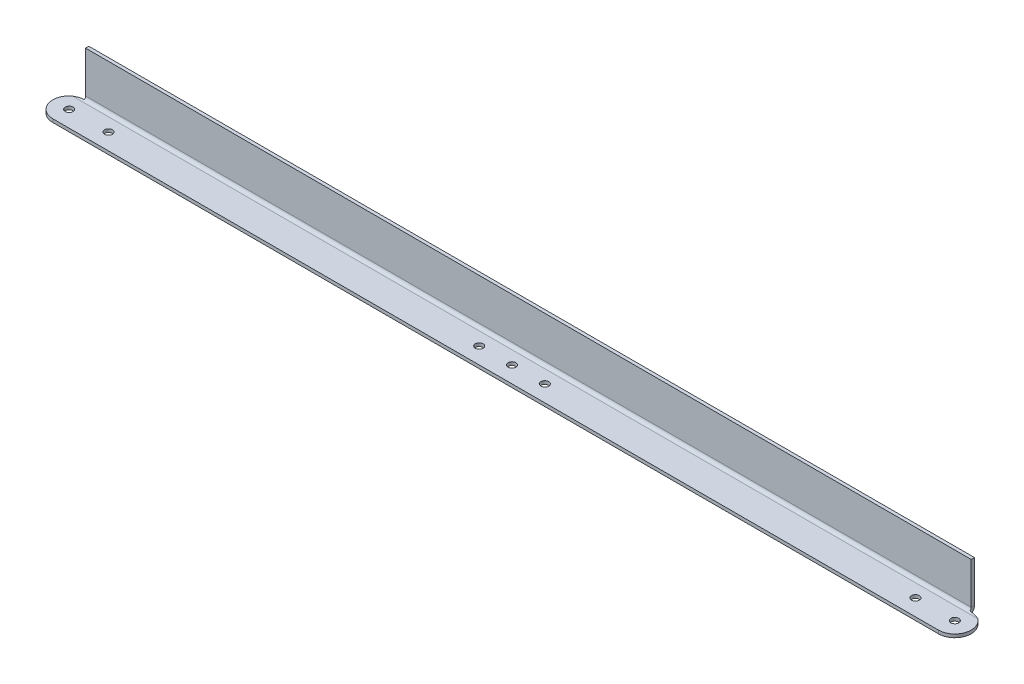
ISO-10303-21;
HEADER;
FILE_DESCRIPTION(('STEP AP214'),'2;1');
FILE_NAME('part.step','',(''),(''),'','','');
FILE_SCHEMA(('AUTOMOTIVE_DESIGN { 1 0 10303 214 1 1 1 1 }'));
ENDSEC;
DATA;
#1=APPLICATION_CONTEXT('core data for automotive mechanical design processes');
#2=APPLICATION_PROTOCOL_DEFINITION('international standard','automotive_design',2000,#1);
#3=PRODUCT_CONTEXT('',#1,'mechanical');
#4=PRODUCT('Part','Part','',(#3));
#5=PRODUCT_RELATED_PRODUCT_CATEGORY('part','',(#4));
#6=PRODUCT_DEFINITION_FORMATION('','',#4);
#7=PRODUCT_DEFINITION_CONTEXT('part definition',#1,'design');
#8=PRODUCT_DEFINITION('design','',#6,#7);
#9=PRODUCT_DEFINITION_SHAPE('','',#8);
#10=(LENGTH_UNIT() NAMED_UNIT(*) SI_UNIT(.MILLI.,.METRE.));
#11=(NAMED_UNIT(*) PLANE_ANGLE_UNIT() SI_UNIT($,.RADIAN.));
#12=(NAMED_UNIT(*) SI_UNIT($,.STERADIAN.) SOLID_ANGLE_UNIT());
#13=UNCERTAINTY_MEASURE_WITH_UNIT(LENGTH_MEASURE(1.E-05),#10,'distance_accuracy_value','');
#14=(GEOMETRIC_REPRESENTATION_CONTEXT(3) GLOBAL_UNCERTAINTY_ASSIGNED_CONTEXT((#13)) GLOBAL_UNIT_ASSIGNED_CONTEXT((#10,
#11,#12)) REPRESENTATION_CONTEXT('',''));
#15=CARTESIAN_POINT('',(0.,0.,0.));
#16=DIRECTION('',(0.,0.,1.));
#17=DIRECTION('',(1.,0.,0.));
#18=AXIS2_PLACEMENT_3D('',#15,#16,#17);
#19=CARTESIAN_POINT('',(-675.,-13.219513774519,24.9995137745192));
#20=DIRECTION('',(0.,1.,0.));
#21=DIRECTION('',(1.,0.,0.));
#22=AXIS2_PLACEMENT_3D('',#19,#20,#21);
#23=CYLINDRICAL_SURFACE('',#22,25.);
#24=CARTESIAN_POINT('',(-675.,-8.21951377451902,24.9995137745192));
#25=DIRECTION('',(0.,1.,0.));
#26=DIRECTION('',(-1.,0.,0.));
#27=AXIS2_PLACEMENT_3D('',#24,#25,#26);
#28=CIRCLE('',#27,25.);
#29=CARTESIAN_POINT('',(-690.000648278752,-8.21951377451909,5.00000000000003));
#30=VERTEX_POINT('',#29);
#31=CARTESIAN_POINT('',(-675.,-8.21951377451894,49.9995137745192));
#32=VERTEX_POINT('',#31);
#33=EDGE_CURVE('E83',#30,#32,#28,.T.);
#34=ORIENTED_EDGE('',*,*,#33,.F.);
#35=CARTESIAN_POINT('',(-690.00064827875,-13.2195137745191,5.00000000000005));
#36=CARTESIAN_POINT('',(-690.00064827875,-8.21951377451909,5.00000000000002));
#37=B_SPLINE_CURVE_WITH_KNOTS('',1,(#35,#36),.UNSPECIFIED.,.F.,.F.,(2,2),(0.,1.),.UNSPECIFIED.);
#38=CARTESIAN_POINT('',(-690.000648278751,-13.2195137745191,5.00000000000004));
#39=VERTEX_POINT('',#38);
#40=EDGE_CURVE('E275',#30,#39,#37,.F.);
#41=ORIENTED_EDGE('',*,*,#40,.T.);
#42=CARTESIAN_POINT('',(-675.,-13.219513774519,24.9995137745192));
#43=DIRECTION('',(0.,1.,0.));
#44=DIRECTION('',(-1.,0.,0.));
#45=AXIS2_PLACEMENT_3D('',#42,#43,#44);
#46=CIRCLE('',#45,25.);
#47=CARTESIAN_POINT('',(-675.,-13.2195137745189,49.9995137745192));
#48=VERTEX_POINT('',#47);
#49=EDGE_CURVE('E386',#39,#48,#46,.T.);
#50=ORIENTED_EDGE('',*,*,#49,.T.);
#51=DIRECTION('',(0.,1.,0.));
#52=VECTOR('',#51,1.);
#53=CARTESIAN_POINT('',(-675.,-13.2195137745189,49.9995137745192));
#54=LINE('',#53,#52);
#55=EDGE_CURVE('E385',#48,#32,#54,.T.);
#56=ORIENTED_EDGE('',*,*,#55,.T.);
#57=EDGE_LOOP('',(#34,#41,#50,#56));
#58=FACE_BOUND('',#57,.T.);
#59=ADVANCED_FACE('F57',(#58),#23,.T.);
#60=CARTESIAN_POINT('',(675.,-13.219513774519,24.9995137745192));
#61=DIRECTION('',(0.,1.,0.));
#62=DIRECTION('',(1.,0.,0.));
#63=AXIS2_PLACEMENT_3D('',#60,#61,#62);
#64=CYLINDRICAL_SURFACE('',#63,25.);
#65=CARTESIAN_POINT('',(675.,-13.219513774519,24.9995137745192));
#66=DIRECTION('',(0.,1.,0.));
#67=DIRECTION('',(1.,0.,0.));
#68=AXIS2_PLACEMENT_3D('',#65,#66,#67);
#69=CIRCLE('',#68,25.);
#70=CARTESIAN_POINT('',(675.,-13.2195137745189,49.9995137745192));
#71=VERTEX_POINT('',#70);
#72=CARTESIAN_POINT('',(690.000648278752,-13.2195137745191,5.00000000000003));
#73=VERTEX_POINT('',#72);
#74=EDGE_CURVE('E389',#71,#73,#69,.T.);
#75=ORIENTED_EDGE('',*,*,#74,.T.);
#76=CARTESIAN_POINT('',(690.000648278752,-8.21951377451909,5.00000000000001));
#77=CARTESIAN_POINT('',(690.000648278752,-13.2195137745191,5.00000000000002));
#78=B_SPLINE_CURVE_WITH_KNOTS('',1,(#76,#77),.UNSPECIFIED.,.F.,.F.,(2,2),(0.,1.),.UNSPECIFIED.);
#79=CARTESIAN_POINT('',(690.000648278752,-8.21951377451909,5.00000000000001));
#80=VERTEX_POINT('',#79);
#81=EDGE_CURVE('E12',#73,#80,#78,.F.);
#82=ORIENTED_EDGE('',*,*,#81,.T.);
#83=CARTESIAN_POINT('',(675.,-8.21951377451902,24.9995137745192));
#84=DIRECTION('',(0.,1.,0.));
#85=DIRECTION('',(1.,0.,0.));
#86=AXIS2_PLACEMENT_3D('',#83,#84,#85);
#87=CIRCLE('',#86,25.);
#88=CARTESIAN_POINT('',(675.,-8.21951377451894,49.9995137745192));
#89=VERTEX_POINT('',#88);
#90=EDGE_CURVE('E76',#89,#80,#87,.T.);
#91=ORIENTED_EDGE('',*,*,#90,.F.);
#92=DIRECTION('',(0.,1.,0.));
#93=VECTOR('',#92,1.);
#94=CARTESIAN_POINT('',(675.,-13.2195137745189,49.9995137745192));
#95=LINE('',#94,#93);
#96=EDGE_CURVE('E390',#71,#89,#95,.T.);
#97=ORIENTED_EDGE('',*,*,#96,.F.);
#98=EDGE_LOOP('',(#75,#82,#91,#97));
#99=FACE_BOUND('',#98,.T.);
#100=ADVANCED_FACE('F59',(#99),#64,.T.);
#101=CARTESIAN_POINT('',(675.,-8.21951377451902,24.9995137745192));
#102=DIRECTION('',(0.,1.,0.));
#103=DIRECTION('',(1.,0.,0.));
#104=AXIS2_PLACEMENT_3D('',#101,#102,#103);
#105=PLANE('',#104);
#106=CARTESIAN_POINT('',(50.,-8.21951377451902,24.9995137745192));
#107=DIRECTION('',(0.,1.,0.));
#108=DIRECTION('',(1.,0.,0.));
#109=AXIS2_PLACEMENT_3D('',#106,#107,#108);
#110=CIRCLE('',#109,6.);
#111=CARTESIAN_POINT('',(56.,-8.21951377451902,24.9995137745192));
#112=VERTEX_POINT('',#111);
#113=EDGE_CURVE('E343',#112,#112,#110,.T.);
#114=ORIENTED_EDGE('',*,*,#113,.F.);
#115=EDGE_LOOP('',(#114));
#116=FACE_BOUND('',#115,.T.);
#117=CARTESIAN_POINT('',(-50.,-8.21951377451902,24.9995137745192));
#118=DIRECTION('',(0.,1.,0.));
#119=DIRECTION('',(1.,0.,0.));
#120=AXIS2_PLACEMENT_3D('',#117,#118,#119);
#121=CIRCLE('',#120,6.);
#122=CARTESIAN_POINT('',(-44.,-8.21951377451902,24.9995137745192));
#123=VERTEX_POINT('',#122);
#124=EDGE_CURVE('E342',#123,#123,#121,.T.);
#125=ORIENTED_EDGE('',*,*,#124,.F.);
#126=EDGE_LOOP('',(#125));
#127=FACE_BOUND('',#126,.T.);
#128=CARTESIAN_POINT('',(0.,-8.21951377451902,24.9995137745192));
#129=DIRECTION('',(0.,1.,0.));
#130=DIRECTION('',(1.,0.,0.));
#131=AXIS2_PLACEMENT_3D('',#128,#129,#130);
#132=CIRCLE('',#131,6.);
#133=CARTESIAN_POINT('',(6.,-8.21951377451902,24.9995137745192));
#134=VERTEX_POINT('',#133);
#135=EDGE_CURVE('E350',#134,#134,#132,.T.);
#136=ORIENTED_EDGE('',*,*,#135,.F.);
#137=EDGE_LOOP('',(#136));
#138=FACE_BOUND('',#137,.T.);
#139=CARTESIAN_POINT('',(675.,-8.21951377451902,24.9995137745192));
#140=DIRECTION('',(0.,1.,0.));
#141=DIRECTION('',(-1.,0.,0.));
#142=AXIS2_PLACEMENT_3D('',#139,#140,#141);
#143=CIRCLE('',#142,6.00000000000001);
#144=CARTESIAN_POINT('',(669.,-8.21951377451902,24.9995137745192));
#145=VERTEX_POINT('',#144);
#146=EDGE_CURVE('E356',#145,#145,#143,.T.);
#147=ORIENTED_EDGE('',*,*,#146,.F.);
#148=EDGE_LOOP('',(#147));
#149=FACE_BOUND('',#148,.T.);
#150=CARTESIAN_POINT('',(615.,-8.21951377451902,24.9995137745191));
#151=DIRECTION('',(0.,1.,0.));
#152=DIRECTION('',(-1.,0.,0.));
#153=AXIS2_PLACEMENT_3D('',#150,#151,#152);
#154=CIRCLE('',#153,5.99999999999999);
#155=CARTESIAN_POINT('',(609.,-8.21951377451902,24.9995137745191));
#156=VERTEX_POINT('',#155);
#157=EDGE_CURVE('E362',#156,#156,#154,.T.);
#158=ORIENTED_EDGE('',*,*,#157,.F.);
#159=EDGE_LOOP('',(#158));
#160=FACE_BOUND('',#159,.T.);
#161=CARTESIAN_POINT('',(-615.,-8.21951377451902,24.9995137745192));
#162=DIRECTION('',(0.,1.,0.));
#163=DIRECTION('',(1.,0.,0.));
#164=AXIS2_PLACEMENT_3D('',#161,#162,#163);
#165=CIRCLE('',#164,5.99999999999999);
#166=CARTESIAN_POINT('',(-609.,-8.21951377451902,24.9995137745192));
#167=VERTEX_POINT('',#166);
#168=EDGE_CURVE('E368',#167,#167,#165,.T.);
#169=ORIENTED_EDGE('',*,*,#168,.F.);
#170=EDGE_LOOP('',(#169));
#171=FACE_BOUND('',#170,.T.);
#172=CARTESIAN_POINT('',(-675.,-8.21951377451902,24.9995137745192));
#173=DIRECTION('',(0.,1.,0.));
#174=DIRECTION('',(1.,0.,0.));
#175=AXIS2_PLACEMENT_3D('',#172,#173,#174);
#176=CIRCLE('',#175,5.99999999999999);
#177=CARTESIAN_POINT('',(-669.,-8.21951377451902,24.9995137745192));
#178=VERTEX_POINT('',#177);
#179=EDGE_CURVE('E374',#178,#178,#176,.T.);
#180=ORIENTED_EDGE('',*,*,#179,.F.);
#181=EDGE_LOOP('',(#180));
#182=FACE_BOUND('',#181,.T.);
#183=ORIENTED_EDGE('',*,*,#90,.T.);
#184=DIRECTION('',(-1.,0.,0.));
#185=VECTOR('',#184,1.);
#186=CARTESIAN_POINT('',(675.,-8.21951377451909,5.00000000000005));
#187=LINE('',#186,#185);
#188=EDGE_CURVE('E69',#80,#30,#187,.T.);
#189=ORIENTED_EDGE('',*,*,#188,.T.);
#190=ORIENTED_EDGE('',*,*,#33,.T.);
#191=DIRECTION('',(1.,0.,0.));
#192=VECTOR('',#191,1.);
#193=CARTESIAN_POINT('',(-675.,-8.21951377451894,49.9995137745192));
#194=LINE('',#193,#192);
#195=EDGE_CURVE('E387',#32,#89,#194,.T.);
#196=ORIENTED_EDGE('',*,*,#195,.T.);
#197=EDGE_LOOP('',(#183,#189,#190,#196));
#198=FACE_BOUND('',#197,.T.);
#199=ADVANCED_FACE('F421',(#116,#127,#138,#149,#160,#171,#182,#198),#105,.T.);
#200=CARTESIAN_POINT('',(-675.,-13.2195137745189,49.9995137745192));
#201=DIRECTION('',(0.,0.,1.));
#202=DIRECTION('',(0.,-1.,0.));
#203=AXIS2_PLACEMENT_3D('',#200,#201,#202);
#204=PLANE('',#203);
#205=ORIENTED_EDGE('',*,*,#195,.F.);
#206=ORIENTED_EDGE('',*,*,#55,.F.);
#207=DIRECTION('',(1.,0.,0.));
#208=VECTOR('',#207,1.);
#209=CARTESIAN_POINT('',(-675.,-13.2195137745189,49.9995137745192));
#210=LINE('',#209,#208);
#211=EDGE_CURVE('E382',#48,#71,#210,.T.);
#212=ORIENTED_EDGE('',*,*,#211,.T.);
#213=ORIENTED_EDGE('',*,*,#96,.T.);
#214=EDGE_LOOP('',(#205,#206,#212,#213));
#215=FACE_BOUND('',#214,.T.);
#216=ADVANCED_FACE('F426',(#215),#204,.T.);
#217=CARTESIAN_POINT('',(675.,-13.219513774519,24.9995137745192));
#218=DIRECTION('',(0.,1.,0.));
#219=DIRECTION('',(1.,0.,0.));
#220=AXIS2_PLACEMENT_3D('',#217,#218,#219);
#221=PLANE('',#220);
#222=DIRECTION('',(-1.,0.,0.));
#223=VECTOR('',#222,1.);
#224=CARTESIAN_POINT('',(675.,-13.2195137745191,5.00000000000003));
#225=LINE('',#224,#223);
#226=EDGE_CURVE('E292',#73,#39,#225,.T.);
#227=ORIENTED_EDGE('',*,*,#226,.F.);
#228=ORIENTED_EDGE('',*,*,#74,.F.);
#229=ORIENTED_EDGE('',*,*,#211,.F.);
#230=ORIENTED_EDGE('',*,*,#49,.F.);
#231=EDGE_LOOP('',(#227,#228,#229,#230));
#232=FACE_BOUND('',#231,.T.);
#233=CARTESIAN_POINT('',(50.,-13.219513774519,24.9995137745192));
#234=DIRECTION('',(0.,1.,0.));
#235=DIRECTION('',(1.,0.,0.));
#236=AXIS2_PLACEMENT_3D('',#233,#234,#235);
#237=CIRCLE('',#236,6.);
#238=CARTESIAN_POINT('',(56.,-13.219513774519,24.9995137745192));
#239=VERTEX_POINT('',#238);
#240=EDGE_CURVE('E339',#239,#239,#237,.T.);
#241=ORIENTED_EDGE('',*,*,#240,.T.);
#242=EDGE_LOOP('',(#241));
#243=FACE_BOUND('',#242,.T.);
#244=CARTESIAN_POINT('',(-50.,-13.219513774519,24.9995137745192));
#245=DIRECTION('',(0.,1.,0.));
#246=DIRECTION('',(1.,0.,0.));
#247=AXIS2_PLACEMENT_3D('',#244,#245,#246);
#248=CIRCLE('',#247,6.);
#249=CARTESIAN_POINT('',(-44.,-13.219513774519,24.9995137745192));
#250=VERTEX_POINT('',#249);
#251=EDGE_CURVE('E347',#250,#250,#248,.T.);
#252=ORIENTED_EDGE('',*,*,#251,.T.);
#253=EDGE_LOOP('',(#252));
#254=FACE_BOUND('',#253,.T.);
#255=CARTESIAN_POINT('',(0.,-13.219513774519,24.9995137745192));
#256=DIRECTION('',(0.,1.,0.));
#257=DIRECTION('',(1.,0.,0.));
#258=AXIS2_PLACEMENT_3D('',#255,#256,#257);
#259=CIRCLE('',#258,6.);
#260=CARTESIAN_POINT('',(6.,-13.219513774519,24.9995137745192));
#261=VERTEX_POINT('',#260);
#262=EDGE_CURVE('E353',#261,#261,#259,.T.);
#263=ORIENTED_EDGE('',*,*,#262,.T.);
#264=EDGE_LOOP('',(#263));
#265=FACE_BOUND('',#264,.T.);
#266=CARTESIAN_POINT('',(675.,-13.219513774519,24.9995137745192));
#267=DIRECTION('',(0.,1.,0.));
#268=DIRECTION('',(-1.,0.,0.));
#269=AXIS2_PLACEMENT_3D('',#266,#267,#268);
#270=CIRCLE('',#269,6.00000000000001);
#271=CARTESIAN_POINT('',(669.,-13.219513774519,24.9995137745192));
#272=VERTEX_POINT('',#271);
#273=EDGE_CURVE('E359',#272,#272,#270,.T.);
#274=ORIENTED_EDGE('',*,*,#273,.T.);
#275=EDGE_LOOP('',(#274));
#276=FACE_BOUND('',#275,.T.);
#277=CARTESIAN_POINT('',(615.,-13.219513774519,24.9995137745191));
#278=DIRECTION('',(0.,1.,0.));
#279=DIRECTION('',(-1.,0.,0.));
#280=AXIS2_PLACEMENT_3D('',#277,#278,#279);
#281=CIRCLE('',#280,5.99999999999999);
#282=CARTESIAN_POINT('',(609.,-13.219513774519,24.9995137745191));
#283=VERTEX_POINT('',#282);
#284=EDGE_CURVE('E365',#283,#283,#281,.T.);
#285=ORIENTED_EDGE('',*,*,#284,.T.);
#286=EDGE_LOOP('',(#285));
#287=FACE_BOUND('',#286,.T.);
#288=CARTESIAN_POINT('',(-615.,-13.219513774519,24.9995137745192));
#289=DIRECTION('',(0.,1.,0.));
#290=DIRECTION('',(1.,0.,0.));
#291=AXIS2_PLACEMENT_3D('',#288,#289,#290);
#292=CIRCLE('',#291,5.99999999999999);
#293=CARTESIAN_POINT('',(-609.,-13.219513774519,24.9995137745192));
#294=VERTEX_POINT('',#293);
#295=EDGE_CURVE('E371',#294,#294,#292,.T.);
#296=ORIENTED_EDGE('',*,*,#295,.T.);
#297=EDGE_LOOP('',(#296));
#298=FACE_BOUND('',#297,.T.);
#299=CARTESIAN_POINT('',(-675.,-13.219513774519,24.9995137745192));
#300=DIRECTION('',(0.,1.,0.));
#301=DIRECTION('',(1.,0.,0.));
#302=AXIS2_PLACEMENT_3D('',#299,#300,#301);
#303=CIRCLE('',#302,5.99999999999999);
#304=CARTESIAN_POINT('',(-669.,-13.219513774519,24.9995137745192));
#305=VERTEX_POINT('',#304);
#306=EDGE_CURVE('E377',#305,#305,#303,.T.);
#307=ORIENTED_EDGE('',*,*,#306,.T.);
#308=EDGE_LOOP('',(#307));
#309=FACE_BOUND('',#308,.T.);
#310=ADVANCED_FACE('F438',(#232,#243,#254,#265,#276,#287,#298,#309),#221,.F.);
#311=CARTESIAN_POINT('',(-675.,-13.219513774519,24.9995137745192));
#312=DIRECTION('',(0.,1.,0.));
#313=DIRECTION('',(1.,0.,0.));
#314=AXIS2_PLACEMENT_3D('',#311,#312,#313);
#315=CYLINDRICAL_SURFACE('',#314,5.99999999999999);
#316=ORIENTED_EDGE('',*,*,#306,.F.);
#317=EDGE_LOOP('',(#316));
#318=FACE_BOUND('',#317,.T.);
#319=ORIENTED_EDGE('',*,*,#179,.T.);
#320=EDGE_LOOP('',(#319));
#321=FACE_BOUND('',#320,.T.);
#322=ADVANCED_FACE('F441',(#318,#321),#315,.F.);
#323=CARTESIAN_POINT('',(-615.,-13.219513774519,24.9995137745192));
#324=DIRECTION('',(0.,1.,0.));
#325=DIRECTION('',(1.,0.,0.));
#326=AXIS2_PLACEMENT_3D('',#323,#324,#325);
#327=CYLINDRICAL_SURFACE('',#326,5.99999999999999);
#328=ORIENTED_EDGE('',*,*,#295,.F.);
#329=EDGE_LOOP('',(#328));
#330=FACE_BOUND('',#329,.T.);
#331=ORIENTED_EDGE('',*,*,#168,.T.);
#332=EDGE_LOOP('',(#331));
#333=FACE_BOUND('',#332,.T.);
#334=ADVANCED_FACE('F447',(#330,#333),#327,.F.);
#335=CARTESIAN_POINT('',(615.,-13.219513774519,24.9995137745191));
#336=DIRECTION('',(0.,1.,0.));
#337=DIRECTION('',(1.,0.,0.));
#338=AXIS2_PLACEMENT_3D('',#335,#336,#337);
#339=CYLINDRICAL_SURFACE('',#338,5.99999999999999);
#340=ORIENTED_EDGE('',*,*,#284,.F.);
#341=EDGE_LOOP('',(#340));
#342=FACE_BOUND('',#341,.T.);
#343=ORIENTED_EDGE('',*,*,#157,.T.);
#344=EDGE_LOOP('',(#343));
#345=FACE_BOUND('',#344,.T.);
#346=ADVANCED_FACE('F451',(#342,#345),#339,.F.);
#347=CARTESIAN_POINT('',(675.,-13.219513774519,24.9995137745192));
#348=DIRECTION('',(0.,1.,0.));
#349=DIRECTION('',(1.,0.,0.));
#350=AXIS2_PLACEMENT_3D('',#347,#348,#349);
#351=CYLINDRICAL_SURFACE('',#350,6.00000000000001);
#352=ORIENTED_EDGE('',*,*,#273,.F.);
#353=EDGE_LOOP('',(#352));
#354=FACE_BOUND('',#353,.T.);
#355=ORIENTED_EDGE('',*,*,#146,.T.);
#356=EDGE_LOOP('',(#355));
#357=FACE_BOUND('',#356,.T.);
#358=ADVANCED_FACE('F455',(#354,#357),#351,.F.);
#359=CARTESIAN_POINT('',(0.,-13.219513774519,24.9995137745192));
#360=DIRECTION('',(0.,1.,0.));
#361=DIRECTION('',(1.,0.,0.));
#362=AXIS2_PLACEMENT_3D('',#359,#360,#361);
#363=CYLINDRICAL_SURFACE('',#362,6.);
#364=ORIENTED_EDGE('',*,*,#262,.F.);
#365=EDGE_LOOP('',(#364));
#366=FACE_BOUND('',#365,.T.);
#367=ORIENTED_EDGE('',*,*,#135,.T.);
#368=EDGE_LOOP('',(#367));
#369=FACE_BOUND('',#368,.T.);
#370=ADVANCED_FACE('F459',(#366,#369),#363,.F.);
#371=CARTESIAN_POINT('',(-50.,-13.219513774519,24.9995137745192));
#372=DIRECTION('',(0.,1.,0.));
#373=DIRECTION('',(1.,0.,0.));
#374=AXIS2_PLACEMENT_3D('',#371,#372,#373);
#375=CYLINDRICAL_SURFACE('',#374,6.);
#376=ORIENTED_EDGE('',*,*,#251,.F.);
#377=EDGE_LOOP('',(#376));
#378=FACE_BOUND('',#377,.T.);
#379=ORIENTED_EDGE('',*,*,#124,.T.);
#380=EDGE_LOOP('',(#379));
#381=FACE_BOUND('',#380,.T.);
#382=ADVANCED_FACE('F463',(#378,#381),#375,.F.);
#383=CARTESIAN_POINT('',(50.,-13.219513774519,24.9995137745192));
#384=DIRECTION('',(0.,1.,0.));
#385=DIRECTION('',(1.,0.,0.));
#386=AXIS2_PLACEMENT_3D('',#383,#384,#385);
#387=CYLINDRICAL_SURFACE('',#386,6.);
#388=ORIENTED_EDGE('',*,*,#240,.F.);
#389=EDGE_LOOP('',(#388));
#390=FACE_BOUND('',#389,.T.);
#391=ORIENTED_EDGE('',*,*,#113,.T.);
#392=EDGE_LOOP('',(#391));
#393=FACE_BOUND('',#392,.T.);
#394=ADVANCED_FACE('F467',(#390,#393),#387,.F.);
#395=CARTESIAN_POINT('',(-675.,60.,-5.));
#396=DIRECTION('',(0.,1.,0.));
#397=DIRECTION('',(0.,0.,1.));
#398=AXIS2_PLACEMENT_3D('',#395,#396,#397);
#399=PLANE('',#398);
#400=DIRECTION('',(-1.,0.,0.));
#401=VECTOR('',#400,1.);
#402=CARTESIAN_POINT('',(-675.,60.,0.));
#403=LINE('',#402,#401);
#404=CARTESIAN_POINT('',(675.,60.,0.));
#405=VERTEX_POINT('',#404);
#406=CARTESIAN_POINT('',(-675.,60.,0.));
#407=VERTEX_POINT('',#406);
#408=EDGE_CURVE('E514',#405,#407,#403,.T.);
#409=ORIENTED_EDGE('',*,*,#408,.F.);
#410=DIRECTION('',(0.,0.,1.));
#411=VECTOR('',#410,1.);
#412=CARTESIAN_POINT('',(675.,60.,-5.));
#413=LINE('',#412,#411);
#414=CARTESIAN_POINT('',(675.,60.,-5.));
#415=VERTEX_POINT('',#414);
#416=EDGE_CURVE('E346',#415,#405,#413,.T.);
#417=ORIENTED_EDGE('',*,*,#416,.F.);
#418=DIRECTION('',(-1.,0.,0.));
#419=VECTOR('',#418,1.);
#420=CARTESIAN_POINT('',(-675.,60.,-5.));
#421=LINE('',#420,#419);
#422=CARTESIAN_POINT('',(-675.,60.,-5.));
#423=VERTEX_POINT('',#422);
#424=EDGE_CURVE('E329',#415,#423,#421,.T.);
#425=ORIENTED_EDGE('',*,*,#424,.T.);
#426=DIRECTION('',(0.,0.,1.));
#427=VECTOR('',#426,1.);
#428=CARTESIAN_POINT('',(-675.,60.,-5.));
#429=LINE('',#428,#427);
#430=EDGE_CURVE('E333',#423,#407,#429,.T.);
#431=ORIENTED_EDGE('',*,*,#430,.T.);
#432=EDGE_LOOP('',(#409,#417,#425,#431));
#433=FACE_BOUND('',#432,.T.);
#434=ADVANCED_FACE('F471',(#433),#399,.T.);
#435=CARTESIAN_POINT('',(675.,-35.,-5.));
#436=DIRECTION('',(0.,0.,1.));
#437=DIRECTION('',(1.,0.,0.));
#438=AXIS2_PLACEMENT_3D('',#435,#436,#437);
#439=PLANE('',#438);
#440=DIRECTION('',(0.,1.,0.));
#441=VECTOR('',#440,1.);
#442=CARTESIAN_POINT('',(675.,-9.99999999999995,-5.));
#443=LINE('',#442,#441);
#444=CARTESIAN_POINT('',(675.,-3.21951377451909,-5.));
#445=VERTEX_POINT('',#444);
#446=EDGE_CURVE('E510',#445,#415,#443,.T.);
#447=ORIENTED_EDGE('',*,*,#446,.F.);
#448=DIRECTION('',(-1.,0.,0.));
#449=VECTOR('',#448,1.);
#450=CARTESIAN_POINT('',(675.,-3.21951377451909,-5.));
#451=LINE('',#450,#449);
#452=CARTESIAN_POINT('',(-674.999999999999,-3.21951377451909,-5.));
#453=VERTEX_POINT('',#452);
#454=EDGE_CURVE('E172',#445,#453,#451,.T.);
#455=ORIENTED_EDGE('',*,*,#454,.T.);
#456=DIRECTION('',(0.,-1.,0.));
#457=VECTOR('',#456,1.);
#458=CARTESIAN_POINT('',(-675.,-10.,-5.));
#459=LINE('',#458,#457);
#460=EDGE_CURVE('E519',#423,#453,#459,.T.);
#461=ORIENTED_EDGE('',*,*,#460,.F.);
#462=ORIENTED_EDGE('',*,*,#424,.F.);
#463=EDGE_LOOP('',(#447,#455,#461,#462));
#464=FACE_BOUND('',#463,.T.);
#465=ADVANCED_FACE('F484',(#464),#439,.F.);
#466=CARTESIAN_POINT('',(-675.,-10.,-5.));
#467=DIRECTION('',(-1.,0.,0.));
#468=DIRECTION('',(0.,0.,1.));
#469=AXIS2_PLACEMENT_3D('',#466,#467,#468);
#470=PLANE('',#469);
#471=DIRECTION('',(0.,0.,-1.));
#472=VECTOR('',#471,1.);
#473=CARTESIAN_POINT('',(-675.,-3.21951377451909,-4.99999999999995));
#474=LINE('',#473,#472);
#475=CARTESIAN_POINT('',(-675.,-3.21951377451912,0.));
#476=VERTEX_POINT('',#475);
#477=EDGE_CURVE('E326',#476,#453,#474,.T.);
#478=ORIENTED_EDGE('',*,*,#477,.F.);
#479=DIRECTION('',(0.,-1.,0.));
#480=VECTOR('',#479,1.);
#481=CARTESIAN_POINT('',(-675.,-10.,0.));
#482=LINE('',#481,#480);
#483=EDGE_CURVE('E512',#407,#476,#482,.T.);
#484=ORIENTED_EDGE('',*,*,#483,.F.);
#485=ORIENTED_EDGE('',*,*,#430,.F.);
#486=ORIENTED_EDGE('',*,*,#460,.T.);
#487=EDGE_LOOP('',(#478,#484,#485,#486));
#488=FACE_BOUND('',#487,.T.);
#489=ADVANCED_FACE('F480',(#488),#470,.T.);
#490=CARTESIAN_POINT('',(675.,-35.,0.));
#491=DIRECTION('',(0.,0.,1.));
#492=DIRECTION('',(1.,0.,0.));
#493=AXIS2_PLACEMENT_3D('',#490,#491,#492);
#494=PLANE('',#493);
#495=DIRECTION('',(-1.,0.,0.));
#496=VECTOR('',#495,1.);
#497=CARTESIAN_POINT('',(675.,-3.21951377451912,0.));
#498=LINE('',#497,#496);
#499=CARTESIAN_POINT('',(675.,-3.21951377451912,0.));
#500=VERTEX_POINT('',#499);
#501=EDGE_CURVE('E330',#500,#476,#498,.T.);
#502=ORIENTED_EDGE('',*,*,#501,.F.);
#503=DIRECTION('',(0.,1.,0.));
#504=VECTOR('',#503,1.);
#505=CARTESIAN_POINT('',(675.,-9.99999999999995,0.));
#506=LINE('',#505,#504);
#507=EDGE_CURVE('E517',#500,#405,#506,.T.);
#508=ORIENTED_EDGE('',*,*,#507,.T.);
#509=ORIENTED_EDGE('',*,*,#408,.T.);
#510=ORIENTED_EDGE('',*,*,#483,.T.);
#511=EDGE_LOOP('',(#502,#508,#509,#510));
#512=FACE_BOUND('',#511,.T.);
#513=ADVANCED_FACE('F476',(#512),#494,.T.);
#514=CARTESIAN_POINT('',(675.,-9.99999999999995,-5.));
#515=DIRECTION('',(1.,0.,0.));
#516=DIRECTION('',(0.,0.,-1.));
#517=AXIS2_PLACEMENT_3D('',#514,#515,#516);
#518=PLANE('',#517);
#519=DIRECTION('',(0.,0.,1.));
#520=VECTOR('',#519,1.);
#521=CARTESIAN_POINT('',(675.,-3.21951377451909,-4.99999999999995));
#522=LINE('',#521,#520);
#523=EDGE_CURVE('E151',#445,#500,#522,.T.);
#524=ORIENTED_EDGE('',*,*,#523,.F.);
#525=ORIENTED_EDGE('',*,*,#446,.T.);
#526=ORIENTED_EDGE('',*,*,#416,.T.);
#527=ORIENTED_EDGE('',*,*,#507,.F.);
#528=EDGE_LOOP('',(#524,#525,#526,#527));
#529=FACE_BOUND('',#528,.T.);
#530=ADVANCED_FACE('F473',(#529),#518,.T.);
#531=CARTESIAN_POINT('',(675.,-11.0779854762339,-1.18420750891718));
#532=CARTESIAN_POINT('',(676.412671145493,-11.0821347914643,-1.17893484038641));
#533=CARTESIAN_POINT('',(677.798698093379,-11.1809330756484,-1.05873493540471));
#534=CARTESIAN_POINT('',(679.837770459299,-11.4459990312004,-0.687535221699956));
#535=CARTESIAN_POINT('',(680.510800003037,-11.5533352559704,-0.5316064150216));
#536=CARTESIAN_POINT('',(681.510352451292,-11.734676319145,-0.244503726993768));
#537=CARTESIAN_POINT('',(681.841871289485,-11.7984750753531,-0.139921057869663));
#538=CARTESIAN_POINT('',(682.336651579936,-11.8978225538454,0.0309660796838068));
#539=CARTESIAN_POINT('',(682.501162015614,-11.9315439741547,0.0902642573966918));
#540=CARTESIAN_POINT('',(682.829350231356,-11.9999358454026,0.213648203620914));
#541=CARTESIAN_POINT('',(682.996149419936,-12.0352755358077,0.279006160642819));
#542=CARTESIAN_POINT('',(683.796849638648,-12.2069429319396,0.605329437931457));
#543=CARTESIAN_POINT('',(684.420416854446,-12.3462905025764,0.898018558836963));
#544=CARTESIAN_POINT('',(685.330278239385,-12.5459596932819,1.38773162386081));
#545=CARTESIAN_POINT('',(685.629317127905,-12.6109275264842,1.55940302474482));
#546=CARTESIAN_POINT('',(686.071503100995,-12.7041808025712,1.82979790570624));
#547=CARTESIAN_POINT('',(686.21783636541,-12.734563614431,1.9220760564333));
#548=CARTESIAN_POINT('',(686.435743172111,-12.7788418844244,2.06372797551544));
#549=CARTESIAN_POINT('',(686.508113259357,-12.7933852026856,2.11148428529127));
#550=CARTESIAN_POINT('',(686.616270117746,-12.8148445696974,2.18392805127469));
#551=CARTESIAN_POINT('',(686.652256025129,-12.8219384166777,2.20821084909481));
#552=CARTESIAN_POINT('',(686.706135318084,-12.8324862803316,2.24483738767482));
#553=CARTESIAN_POINT('',(686.724078487715,-12.8359867499841,2.25707995700377));
#554=CARTESIAN_POINT('',(686.750968350132,-12.8412137240438,2.27549439460172));
#555=CARTESIAN_POINT('',(686.759927488933,-12.8429520936338,2.28164097103613));
#556=CARTESIAN_POINT('',(686.777837469191,-12.8464208384567,2.29395098446785));
#557=CARTESIAN_POINT('',(686.78971344356,-12.8487156414597,2.30213232141013));
#558=CARTESIAN_POINT('',(687.181114835382,-12.9242396677068,2.57214017093161));
#559=CARTESIAN_POINT('',(687.640880857633,-13.0128924068252,2.9272322503277));
#560=CARTESIAN_POINT('',(688.709185282739,-13.1605573111754,3.82429400694888));
#561=CARTESIAN_POINT('',(689.317517284551,-13.2195137745191,4.36673260144675));
#562=CARTESIAN_POINT('',(690.000648278752,-13.2195137745191,5.00000000000002));
#563=CARTESIAN_POINT('',(675.000000000001,-7.14874962537649,1.90789624554141));
#564=CARTESIAN_POINT('',(676.412671438742,-7.15082428342237,1.91053258035407));
#565=CARTESIAN_POINT('',(677.798698093379,-7.20022342508375,1.97063253229764));
#566=CARTESIAN_POINT('',(679.837770459299,-7.33275640285972,2.15623238915003));
#567=CARTESIAN_POINT('',(680.510800003037,-7.38642451524474,2.2341967924892));
#568=CARTESIAN_POINT('',(681.510352451292,-7.47709504683205,2.37774813650312));
#569=CARTESIAN_POINT('',(681.841871289485,-7.50899442493609,2.43003947106517));
#570=CARTESIAN_POINT('',(682.336651579936,-7.55866816418224,2.51548303984191));
#571=CARTESIAN_POINT('',(682.501162015614,-7.5755288743369,2.54513212869835));
#572=CARTESIAN_POINT('',(682.829350231356,-7.60972480996084,2.60682410181046));
#573=CARTESIAN_POINT('',(682.996149419936,-7.62739465516342,2.63950308032141));
#574=CARTESIAN_POINT('',(683.796849638648,-7.71322835322936,2.80266471896573));
#575=CARTESIAN_POINT('',(684.420416854446,-7.78290213854774,2.94900927941848));
#576=CARTESIAN_POINT('',(685.330278239385,-7.88273673390051,3.19386581193041));
#577=CARTESIAN_POINT('',(685.629317127905,-7.91522065050163,3.27970151237241));
#578=CARTESIAN_POINT('',(686.071503100995,-7.96184728854514,3.41489895285312));
#579=CARTESIAN_POINT('',(686.217836365411,-7.97703869447502,3.46103802821665));
#580=CARTESIAN_POINT('',(686.435743172111,-7.99917782947175,3.53186398775772));
#581=CARTESIAN_POINT('',(686.508113259357,-8.00644948860237,3.55574214264563));
#582=CARTESIAN_POINT('',(686.616270117746,-8.01717917210827,3.59196402563734));
#583=CARTESIAN_POINT('',(686.652256025129,-8.0207260955984,3.60410542454741));
#584=CARTESIAN_POINT('',(686.706135318084,-8.02600002742534,3.62241869383741));
#585=CARTESIAN_POINT('',(686.724078487715,-8.02775026225161,3.62853997850189));
#586=CARTESIAN_POINT('',(686.750968350132,-8.03036374928143,3.63774719730086));
#587=CARTESIAN_POINT('',(686.759927488933,-8.03123293407646,3.64082048551806));
#588=CARTESIAN_POINT('',(686.777837469191,-8.03296730648792,3.64697549223392));
#589=CARTESIAN_POINT('',(686.78971344356,-8.03411470798937,3.65106616070506));
#590=CARTESIAN_POINT('',(687.181114835382,-8.07187672111295,3.78607008546581));
#591=CARTESIAN_POINT('',(687.640880857633,-8.11620309067217,3.96361612516385));
#592=CARTESIAN_POINT('',(688.709185282739,-8.19003554284723,4.41214700347444));
#593=CARTESIAN_POINT('',(689.317644709842,-8.21951377451909,4.68342536280888));
#594=CARTESIAN_POINT('',(690.000648278752,-8.21951377451909,5.00000000000001));
#595=B_SPLINE_SURFACE_WITH_KNOTS('',1,3,((#531,#532,#533,#534,#535,#536,#537,#538,#539,#540,
#541,#542,#543,#544,#545,#546,#547,#548,#549,#550,#551,#552,#553,#554,#555,#556,#557,#558,#559,
#560,#561,#562),(#563,#564,#565,#566,#567,#568,#569,#570,#571,#572,#573,#574,#575,#576,#577,
#578,#579,#580,#581,#582,#583,#584,#585,#586,#587,#588,#589,#590,#591,#592,#593,#594)),
.UNSPECIFIED.,.F.,.F.,.F.,(2,2),(4,2,2,2,2,2,2,2,2,2,2,2,2,2,2,4),(0.,1.),(0.,0.25,0.375,0.4375,
0.46875,0.5,0.625,0.6875,0.71875,0.734375,0.7421875,0.74609375,0.748046875,0.75,0.875,1.),.UNSPECIFIED.);
#596=CARTESIAN_POINT('',(675.,-11.0779854762339,-1.18420750891718));
#597=CARTESIAN_POINT('',(675.000000000001,-7.14874962537649,1.90789624554141));
#598=B_SPLINE_CURVE_WITH_KNOTS('',1,(#596,#597),.UNSPECIFIED.,.F.,.F.,(2,2),(0.,1.),.UNSPECIFIED.);
#599=CARTESIAN_POINT('',(675.000000000001,-7.14874962537649,1.90789624554141));
#600=VERTEX_POINT('',#599);
#601=CARTESIAN_POINT('',(675.,-11.0779854762339,-1.18420750891718));
#602=VERTEX_POINT('',#601);
#603=EDGE_CURVE('E138',#600,#602,#598,.F.);
#604=CARTESIAN_POINT('',(675.000000000001,-7.14874962537649,1.90789624554141));
#605=CARTESIAN_POINT('',(676.412671438742,-7.15082428342237,1.91053258035407));
#606=CARTESIAN_POINT('',(677.798698093379,-7.20022342508375,1.97063253229764));
#607=CARTESIAN_POINT('',(679.837770459299,-7.33275640285972,2.15623238915003));
#608=CARTESIAN_POINT('',(680.510800003037,-7.38642451524474,2.2341967924892));
#609=CARTESIAN_POINT('',(681.510352451292,-7.47709504683205,2.37774813650312));
#610=CARTESIAN_POINT('',(681.841871289485,-7.50899442493609,2.43003947106517));
#611=CARTESIAN_POINT('',(682.336651579936,-7.55866816418224,2.51548303984191));
#612=CARTESIAN_POINT('',(682.501162015614,-7.5755288743369,2.54513212869835));
#613=CARTESIAN_POINT('',(682.829350231356,-7.60972480996084,2.60682410181046));
#614=CARTESIAN_POINT('',(682.996149419936,-7.62739465516342,2.63950308032141));
#615=CARTESIAN_POINT('',(683.796849638648,-7.71322835322936,2.80266471896573));
#616=CARTESIAN_POINT('',(684.420416854446,-7.78290213854774,2.94900927941848));
#617=CARTESIAN_POINT('',(685.330278239385,-7.88273673390051,3.19386581193041));
#618=CARTESIAN_POINT('',(685.629317127905,-7.91522065050163,3.27970151237241));
#619=CARTESIAN_POINT('',(686.071503100995,-7.96184728854514,3.41489895285312));
#620=CARTESIAN_POINT('',(686.217836365411,-7.97703869447502,3.46103802821665));
#621=CARTESIAN_POINT('',(686.435743172111,-7.99917782947175,3.53186398775772));
#622=CARTESIAN_POINT('',(686.508113259357,-8.00644948860237,3.55574214264563));
#623=CARTESIAN_POINT('',(686.616270117746,-8.01717917210827,3.59196402563734));
#624=CARTESIAN_POINT('',(686.652256025129,-8.0207260955984,3.60410542454741));
#625=CARTESIAN_POINT('',(686.706135318084,-8.02600002742534,3.62241869383741));
#626=CARTESIAN_POINT('',(686.724078487715,-8.02775026225161,3.62853997850189));
#627=CARTESIAN_POINT('',(686.750968350132,-8.03036374928143,3.63774719730086));
#628=CARTESIAN_POINT('',(686.759927488933,-8.03123293407646,3.64082048551806));
#629=CARTESIAN_POINT('',(686.777837469191,-8.03296730648792,3.64697549223392));
#630=CARTESIAN_POINT('',(686.78971344356,-8.03411470798937,3.65106616070506));
#631=CARTESIAN_POINT('',(687.181114835382,-8.07187672111295,3.78607008546581));
#632=CARTESIAN_POINT('',(687.640880857633,-8.11620309067217,3.96361612516385));
#633=CARTESIAN_POINT('',(688.709185282739,-8.19003554284723,4.41214700347444));
#634=CARTESIAN_POINT('',(689.317644709842,-8.21951377451909,4.68342536280888));
#635=CARTESIAN_POINT('',(690.000648278752,-8.21951377451909,5.00000000000001));
#636=B_SPLINE_CURVE_WITH_KNOTS('',3,(#604,#605,#606,#607,#608,#609,#610,#611,#612,#613,#614,
#615,#616,#617,#618,#619,#620,#621,#622,#623,#624,#625,#626,#627,#628,#629,#630,#631,#632,#633,
#634,#635),.UNSPECIFIED.,.F.,.F.,(4,2,2,2,2,2,2,2,2,2,2,2,2,2,2,4),(0.,0.25,0.375,0.4375,
0.46875,0.5,0.625,0.6875,0.71875,0.734375,0.7421875,0.74609375,0.748046875,0.75,0.875,1.),.UNSPECIFIED.);
#637=EDGE_CURVE('E183',#600,#80,#636,.T.);
#638=CARTESIAN_POINT('',(690.000648278752,-13.2195137745191,5.00000000000002));
#639=CARTESIAN_POINT('',(689.317517284551,-13.2195137745191,4.36673260144675));
#640=CARTESIAN_POINT('',(688.709185282739,-13.1605573111754,3.82429400694888));
#641=CARTESIAN_POINT('',(687.640880857633,-13.0128924068252,2.9272322503277));
#642=CARTESIAN_POINT('',(687.181114835382,-12.9242396677068,2.57214017093161));
#643=CARTESIAN_POINT('',(686.78971344356,-12.8487156414597,2.30213232141013));
#644=CARTESIAN_POINT('',(686.777837469191,-12.8464208384567,2.29395098446785));
#645=CARTESIAN_POINT('',(686.759927488933,-12.8429520936338,2.28164097103613));
#646=CARTESIAN_POINT('',(686.750968350132,-12.8412137240438,2.27549439460172));
#647=CARTESIAN_POINT('',(686.724078487715,-12.8359867499841,2.25707995700377));
#648=CARTESIAN_POINT('',(686.706135318084,-12.8324862803316,2.24483738767482));
#649=CARTESIAN_POINT('',(686.652256025129,-12.8219384166777,2.20821084909481));
#650=CARTESIAN_POINT('',(686.616270117746,-12.8148445696974,2.18392805127469));
#651=CARTESIAN_POINT('',(686.508113259357,-12.7933852026856,2.11148428529127));
#652=CARTESIAN_POINT('',(686.435743172111,-12.7788418844244,2.06372797551544));
#653=CARTESIAN_POINT('',(686.21783636541,-12.734563614431,1.9220760564333));
#654=CARTESIAN_POINT('',(686.071503100995,-12.7041808025712,1.82979790570624));
#655=CARTESIAN_POINT('',(685.629317127905,-12.6109275264842,1.55940302474482));
#656=CARTESIAN_POINT('',(685.330278239385,-12.5459596932819,1.38773162386081));
#657=CARTESIAN_POINT('',(684.420416854446,-12.3462905025764,0.898018558836963));
#658=CARTESIAN_POINT('',(683.796849638648,-12.2069429319396,0.605329437931457));
#659=CARTESIAN_POINT('',(682.996149419936,-12.0352755358077,0.279006160642819));
#660=CARTESIAN_POINT('',(682.829350231356,-11.9999358454026,0.213648203620914));
#661=CARTESIAN_POINT('',(682.501162015614,-11.9315439741547,0.0902642573966918));
#662=CARTESIAN_POINT('',(682.336651579936,-11.8978225538454,0.0309660796838068));
#663=CARTESIAN_POINT('',(681.841871289485,-11.7984750753531,-0.139921057869663));
#664=CARTESIAN_POINT('',(681.510352451292,-11.734676319145,-0.244503726993768));
#665=CARTESIAN_POINT('',(680.510800003037,-11.5533352559704,-0.5316064150216));
#666=CARTESIAN_POINT('',(679.837770459299,-11.4459990312004,-0.687535221699956));
#667=CARTESIAN_POINT('',(677.798698093379,-11.1809330756484,-1.05873493540471));
#668=CARTESIAN_POINT('',(676.412671145493,-11.0821347914643,-1.17893484038641));
#669=CARTESIAN_POINT('',(675.,-11.0779854762339,-1.18420750891718));
#670=B_SPLINE_CURVE_WITH_KNOTS('',3,(#638,#639,#640,#641,#642,#643,#644,#645,#646,#647,#648,
#649,#650,#651,#652,#653,#654,#655,#656,#657,#658,#659,#660,#661,#662,#663,#664,#665,#666,#667,
#668,#669),.UNSPECIFIED.,.F.,.F.,(4,2,2,2,2,2,2,2,2,2,2,2,2,2,2,4),(0.,0.125,0.25,0.251953125,
0.25390625,0.2578125,0.265625,0.28125,0.3125,0.375,0.5,0.53125,0.5625,0.625,0.75,1.),.UNSPECIFIED.);
#671=EDGE_CURVE('E157',#602,#73,#670,.F.);
#672=ORIENTED_EDGE('',*,*,#603,.F.);
#673=ORIENTED_EDGE('',*,*,#637,.T.);
#674=ORIENTED_EDGE('',*,*,#81,.F.);
#675=ORIENTED_EDGE('',*,*,#671,.F.);
#676=EDGE_LOOP('',(#672,#673,#674,#675));
#677=FACE_BOUND('',#676,.T.);
#678=ADVANCED_FACE('F159',(#677),#595,.T.);
#679=CARTESIAN_POINT('',(-690.00064827875,-13.2195137745191,5.00000000000005));
#680=CARTESIAN_POINT('',(-688.937720313177,-13.2195137745191,3.94478538755543));
#681=CARTESIAN_POINT('',(-687.837317053107,-13.0546704201684,3.01992677931029));
#682=CARTESIAN_POINT('',(-686.126616567811,-12.7211604738038,1.85652118618405));
#683=CARTESIAN_POINT('',(-685.546582843149,-12.5952268117492,1.50533883384007));
#684=CARTESIAN_POINT('',(-684.661831911813,-12.4000125899402,1.03167486138804));
#685=CARTESIAN_POINT('',(-684.36446487731,-12.3338553098176,0.882610409849947));
#686=CARTESIAN_POINT('',(-683.914739239469,-12.2346661252664,0.671829744845886));
#687=CARTESIAN_POINT('',(-683.764218179175,-12.2016087439107,0.603704517944071));
#688=CARTESIAN_POINT('',(-683.537517817212,-12.1522218445679,0.504659352566937));
#689=CARTESIAN_POINT('',(-683.461797901304,-12.1357926108209,0.47216803410189));
#690=CARTESIAN_POINT('',(-683.347988334561,-12.1112210346541,0.424208849872494));
#691=CARTESIAN_POINT('',(-683.310013530168,-12.1030425470255,0.408352085311303));
#692=CARTESIAN_POINT('',(-683.233987357086,-12.0867133311406,0.376896491807185));
#693=CARTESIAN_POINT('',(-683.199695623993,-12.0793655711012,0.362824680132878));
#694=CARTESIAN_POINT('',(-682.488257754693,-11.9274194608154,0.0738663708531994));
#695=CARTESIAN_POINT('',(-681.821778683252,-11.7907258699773,-0.156165831581213));
#696=CARTESIAN_POINT('',(-680.826724343234,-11.6082729186641,-0.444414636905241));
#697=CARTESIAN_POINT('',(-680.495816941085,-11.5511692891634,-0.531031185705599));
#698=CARTESIAN_POINT('',(-680.000621904648,-11.4722952753418,-0.647459154138853));
#699=CARTESIAN_POINT('',(-679.835751236967,-11.4471313377521,-0.684018270068987));
#700=CARTESIAN_POINT('',(-679.588736752141,-11.4112030768177,-0.73556143633134));
#701=CARTESIAN_POINT('',(-679.506447176649,-11.3995297630857,-0.752193176870063));
#702=CARTESIAN_POINT('',(-679.383085692584,-11.3824882846531,-0.776326179000853));
#703=CARTESIAN_POINT('',(-679.341977344425,-11.3768858636764,-0.784234740473206));
#704=CARTESIAN_POINT('',(-679.28033304198,-11.368601040451,-0.795895053025995));
#705=CARTESIAN_POINT('',(-679.259787977798,-11.3658592334539,-0.799748068641734));
#706=CARTESIAN_POINT('',(-679.218703922697,-11.3604154968497,-0.807386774047023));
#707=CARTESIAN_POINT('',(-679.19285670831,-11.35702034949,-0.812142327741377));
#708=CARTESIAN_POINT('',(-678.20305420514,-11.2277588988049,-0.992988843607041));
#709=CARTESIAN_POINT('',(-676.810509716953,-11.1329779076726,-1.11432685474335));
#710=CARTESIAN_POINT('',(-674.999999999999,-11.0779854762339,-1.18420750891715));
#711=CARTESIAN_POINT('',(-690.00064827875,-8.21951377451909,5.00000000000002));
#712=CARTESIAN_POINT('',(-688.938239501873,-8.21951377451909,4.4726504043267));
#713=CARTESIAN_POINT('',(-687.837317053107,-8.13709209734373,4.00996338965514));
#714=CARTESIAN_POINT('',(-686.126616567811,-7.97033712416145,3.42826059309203));
#715=CARTESIAN_POINT('',(-685.546582843149,-7.90737029313416,3.25266941692004));
#716=CARTESIAN_POINT('',(-684.661831911813,-7.80976318222965,3.01583743069402));
#717=CARTESIAN_POINT('',(-684.36446487731,-7.77668454216832,2.94130520492497));
#718=CARTESIAN_POINT('',(-683.914739239469,-7.72708994989275,2.83591487242294));
#719=CARTESIAN_POINT('',(-683.764218179175,-7.71056125921491,2.80185225897204));
#720=CARTESIAN_POINT('',(-683.537517817212,-7.68586780954349,2.75232967628347));
#721=CARTESIAN_POINT('',(-683.461797901304,-7.67765319266999,2.73608401705095));
#722=CARTESIAN_POINT('',(-683.347988334561,-7.6653674045866,2.71210442493625));
#723=CARTESIAN_POINT('',(-683.310013530168,-7.66127816077227,2.70417604265565));
#724=CARTESIAN_POINT('',(-683.233987357086,-7.65311355282985,2.68844824590359));
#725=CARTESIAN_POINT('',(-683.199695623993,-7.64943967281016,2.68141234006644));
#726=CARTESIAN_POINT('',(-682.488257754693,-7.57346661766725,2.5369331854266));
#727=CARTESIAN_POINT('',(-681.821778683252,-7.5051198222482,2.42191708420939));
#728=CARTESIAN_POINT('',(-680.826724343234,-7.41389334659157,2.27779268154738));
#729=CARTESIAN_POINT('',(-680.495816941085,-7.38534153184125,2.2344844071472));
#730=CARTESIAN_POINT('',(-680.000621904648,-7.34590452493043,2.17627042293057));
#731=CARTESIAN_POINT('',(-679.835751236967,-7.3333225561356,2.15799086496551));
#732=CARTESIAN_POINT('',(-679.588736752141,-7.31535842566839,2.13221928183433));
#733=CARTESIAN_POINT('',(-679.506447176649,-7.30952176880237,2.12390341156497));
#734=CARTESIAN_POINT('',(-679.383085692584,-7.30100102958611,2.11183691049957));
#735=CARTESIAN_POINT('',(-679.341977344425,-7.29819981909774,2.1078826297634));
#736=CARTESIAN_POINT('',(-679.28033304198,-7.29405740748505,2.102052473487));
#737=CARTESIAN_POINT('',(-679.259787977798,-7.29268650398652,2.10012596567913));
#738=CARTESIAN_POINT('',(-679.218703922697,-7.2899646356844,2.09630661297649));
#739=CARTESIAN_POINT('',(-679.19285670831,-7.28826706200454,2.09392883612931));
#740=CARTESIAN_POINT('',(-678.20305420514,-7.223636336662,2.00350557819648));
#741=CARTESIAN_POINT('',(-676.810510838043,-7.17624585812185,1.9428365942638));
#742=CARTESIAN_POINT('',(-674.999999999999,-7.1487496253765,1.90789624554143));
#743=B_SPLINE_SURFACE_WITH_KNOTS('',1,3,((#679,#680,#681,#682,#683,#684,#685,#686,#687,#688,
#689,#690,#691,#692,#693,#694,#695,#696,#697,#698,#699,#700,#701,#702,#703,#704,#705,#706,#707,
#708,#709,#710),(#711,#712,#713,#714,#715,#716,#717,#718,#719,#720,#721,#722,#723,#724,#725,
#726,#727,#728,#729,#730,#731,#732,#733,#734,#735,#736,#737,#738,#739,#740,#741,#742)),
.UNSPECIFIED.,.F.,.F.,.F.,(2,2),(4,2,2,2,2,2,2,2,2,2,2,2,2,2,2,4),(0.,1.),(0.,0.25,0.375,0.4375,
0.46875,0.484375,0.4921875,0.5,0.625,0.6875,0.71875,0.734375,0.7421875,0.74609375,0.75,1.),.UNSPECIFIED.);
#744=CARTESIAN_POINT('',(-690.00064827875,-8.21951377451909,5.00000000000002));
#745=CARTESIAN_POINT('',(-688.938239501873,-8.21951377451909,4.4726504043267));
#746=CARTESIAN_POINT('',(-687.837317053107,-8.13709209734373,4.00996338965514));
#747=CARTESIAN_POINT('',(-686.126616567811,-7.97033712416145,3.42826059309203));
#748=CARTESIAN_POINT('',(-685.546582843149,-7.90737029313416,3.25266941692004));
#749=CARTESIAN_POINT('',(-684.661831911813,-7.80976318222965,3.01583743069402));
#750=CARTESIAN_POINT('',(-684.36446487731,-7.77668454216832,2.94130520492497));
#751=CARTESIAN_POINT('',(-683.914739239469,-7.72708994989275,2.83591487242294));
#752=CARTESIAN_POINT('',(-683.764218179175,-7.71056125921491,2.80185225897204));
#753=CARTESIAN_POINT('',(-683.537517817212,-7.68586780954349,2.75232967628347));
#754=CARTESIAN_POINT('',(-683.461797901304,-7.67765319266999,2.73608401705095));
#755=CARTESIAN_POINT('',(-683.347988334561,-7.6653674045866,2.71210442493625));
#756=CARTESIAN_POINT('',(-683.310013530168,-7.66127816077227,2.70417604265565));
#757=CARTESIAN_POINT('',(-683.233987357086,-7.65311355282985,2.68844824590359));
#758=CARTESIAN_POINT('',(-683.199695623993,-7.64943967281016,2.68141234006644));
#759=CARTESIAN_POINT('',(-682.488257754693,-7.57346661766725,2.5369331854266));
#760=CARTESIAN_POINT('',(-681.821778683252,-7.5051198222482,2.42191708420939));
#761=CARTESIAN_POINT('',(-680.826724343234,-7.41389334659157,2.27779268154738));
#762=CARTESIAN_POINT('',(-680.495816941085,-7.38534153184125,2.2344844071472));
#763=CARTESIAN_POINT('',(-680.000621904648,-7.34590452493043,2.17627042293057));
#764=CARTESIAN_POINT('',(-679.835751236967,-7.3333225561356,2.15799086496551));
#765=CARTESIAN_POINT('',(-679.588736752141,-7.31535842566839,2.13221928183433));
#766=CARTESIAN_POINT('',(-679.506447176649,-7.30952176880237,2.12390341156497));
#767=CARTESIAN_POINT('',(-679.383085692584,-7.30100102958611,2.11183691049957));
#768=CARTESIAN_POINT('',(-679.341977344425,-7.29819981909774,2.1078826297634));
#769=CARTESIAN_POINT('',(-679.28033304198,-7.29405740748505,2.102052473487));
#770=CARTESIAN_POINT('',(-679.259787977798,-7.29268650398652,2.10012596567913));
#771=CARTESIAN_POINT('',(-679.218703922697,-7.2899646356844,2.09630661297649));
#772=CARTESIAN_POINT('',(-679.19285670831,-7.28826706200454,2.09392883612931));
#773=CARTESIAN_POINT('',(-678.20305420514,-7.223636336662,2.00350557819648));
#774=CARTESIAN_POINT('',(-676.810510838043,-7.17624585812185,1.9428365942638));
#775=CARTESIAN_POINT('',(-674.999999999999,-7.1487496253765,1.90789624554143));
#776=B_SPLINE_CURVE_WITH_KNOTS('',3,(#744,#745,#746,#747,#748,#749,#750,#751,#752,#753,#754,
#755,#756,#757,#758,#759,#760,#761,#762,#763,#764,#765,#766,#767,#768,#769,#770,#771,#772,#773,
#774,#775),.UNSPECIFIED.,.F.,.F.,(4,2,2,2,2,2,2,2,2,2,2,2,2,2,2,4),(0.,0.25,0.375,0.4375,
0.46875,0.484375,0.4921875,0.5,0.625,0.6875,0.71875,0.734375,0.7421875,0.74609375,0.75,1.),.UNSPECIFIED.);
#777=CARTESIAN_POINT('',(-674.999999999998,-7.1487496253765,1.90789624554142));
#778=VERTEX_POINT('',#777);
#779=EDGE_CURVE('E290',#30,#778,#776,.T.);
#780=CARTESIAN_POINT('',(-674.999999999999,-7.1487496253765,1.90789624554143));
#781=CARTESIAN_POINT('',(-674.999999999999,-11.0779854762339,-1.18420750891715));
#782=B_SPLINE_CURVE_WITH_KNOTS('',1,(#780,#781),.UNSPECIFIED.,.F.,.F.,(2,2),(0.,1.),.UNSPECIFIED.);
#783=CARTESIAN_POINT('',(-674.999999999999,-11.0779854762339,-1.18420750891715));
#784=VERTEX_POINT('',#783);
#785=EDGE_CURVE('E152',#778,#784,#782,.T.);
#786=CARTESIAN_POINT('',(-674.999999999999,-11.0779854762339,-1.18420750891715));
#787=CARTESIAN_POINT('',(-676.810509716953,-11.1329779076726,-1.11432685474335));
#788=CARTESIAN_POINT('',(-678.20305420514,-11.2277588988049,-0.992988843607041));
#789=CARTESIAN_POINT('',(-679.19285670831,-11.35702034949,-0.812142327741377));
#790=CARTESIAN_POINT('',(-679.218703922697,-11.3604154968497,-0.807386774047023));
#791=CARTESIAN_POINT('',(-679.259787977798,-11.3658592334539,-0.799748068641734));
#792=CARTESIAN_POINT('',(-679.28033304198,-11.368601040451,-0.795895053025995));
#793=CARTESIAN_POINT('',(-679.341977344425,-11.3768858636764,-0.784234740473206));
#794=CARTESIAN_POINT('',(-679.383085692584,-11.3824882846531,-0.776326179000853));
#795=CARTESIAN_POINT('',(-679.506447176649,-11.3995297630857,-0.752193176870063));
#796=CARTESIAN_POINT('',(-679.588736752141,-11.4112030768177,-0.73556143633134));
#797=CARTESIAN_POINT('',(-679.835751236967,-11.4471313377521,-0.684018270068987));
#798=CARTESIAN_POINT('',(-680.000621904648,-11.4722952753418,-0.647459154138853));
#799=CARTESIAN_POINT('',(-680.495816941085,-11.5511692891634,-0.531031185705599));
#800=CARTESIAN_POINT('',(-680.826724343234,-11.6082729186641,-0.444414636905241));
#801=CARTESIAN_POINT('',(-681.821778683252,-11.7907258699773,-0.156165831581213));
#802=CARTESIAN_POINT('',(-682.488257754693,-11.9274194608154,0.0738663708531994));
#803=CARTESIAN_POINT('',(-683.199695623993,-12.0793655711012,0.362824680132878));
#804=CARTESIAN_POINT('',(-683.233987357086,-12.0867133311406,0.376896491807185));
#805=CARTESIAN_POINT('',(-683.310013530168,-12.1030425470255,0.408352085311303));
#806=CARTESIAN_POINT('',(-683.347988334561,-12.1112210346541,0.424208849872494));
#807=CARTESIAN_POINT('',(-683.461797901304,-12.1357926108209,0.47216803410189));
#808=CARTESIAN_POINT('',(-683.537517817212,-12.1522218445679,0.504659352566937));
#809=CARTESIAN_POINT('',(-683.764218179175,-12.2016087439107,0.603704517944071));
#810=CARTESIAN_POINT('',(-683.914739239469,-12.2346661252664,0.671829744845886));
#811=CARTESIAN_POINT('',(-684.36446487731,-12.3338553098176,0.882610409849947));
#812=CARTESIAN_POINT('',(-684.661831911813,-12.4000125899402,1.03167486138804));
#813=CARTESIAN_POINT('',(-685.546582843149,-12.5952268117492,1.50533883384007));
#814=CARTESIAN_POINT('',(-686.126616567811,-12.7211604738038,1.85652118618405));
#815=CARTESIAN_POINT('',(-687.837317053107,-13.0546704201684,3.01992677931029));
#816=CARTESIAN_POINT('',(-688.937720313177,-13.2195137745191,3.94478538755543));
#817=CARTESIAN_POINT('',(-690.00064827875,-13.2195137745191,5.00000000000005));
#818=B_SPLINE_CURVE_WITH_KNOTS('',3,(#786,#787,#788,#789,#790,#791,#792,#793,#794,#795,#796,
#797,#798,#799,#800,#801,#802,#803,#804,#805,#806,#807,#808,#809,#810,#811,#812,#813,#814,#815,
#816,#817),.UNSPECIFIED.,.F.,.F.,(4,2,2,2,2,2,2,2,2,2,2,2,2,2,2,4),(0.,0.25,0.25390625,
0.2578125,0.265625,0.28125,0.3125,0.375,0.5,0.5078125,0.515625,0.53125,0.5625,0.625,0.75,1.),.UNSPECIFIED.);
#819=EDGE_CURVE('E165',#39,#784,#818,.F.);
#820=ORIENTED_EDGE('',*,*,#40,.F.);
#821=ORIENTED_EDGE('',*,*,#779,.T.);
#822=ORIENTED_EDGE('',*,*,#785,.T.);
#823=ORIENTED_EDGE('',*,*,#819,.F.);
#824=EDGE_LOOP('',(#820,#821,#822,#823));
#825=FACE_BOUND('',#824,.T.);
#826=ADVANCED_FACE('F225',(#825),#743,.T.);
#827=CARTESIAN_POINT('',(-674.999999999999,-3.21951377451909,5.));
#828=DIRECTION('',(-1.,0.,0.));
#829=DIRECTION('',(0.,0.,1.));
#830=AXIS2_PLACEMENT_3D('',#827,#828,#829);
#831=PLANE('',#830);
#832=ORIENTED_EDGE('',*,*,#785,.F.);
#833=CARTESIAN_POINT('',(-674.999999999998,-3.21951377451909,5.));
#834=DIRECTION('',(-1.,0.,0.));
#835=DIRECTION('',(0.,0.,1.));
#836=AXIS2_PLACEMENT_3D('',#833,#834,#835);
#837=CIRCLE('',#836,5.);
#838=EDGE_CURVE('E294',#778,#476,#837,.F.);
#839=ORIENTED_EDGE('',*,*,#838,.T.);
#840=ORIENTED_EDGE('',*,*,#477,.T.);
#841=CARTESIAN_POINT('',(-674.999999999999,-3.21951377451909,5.));
#842=DIRECTION('',(1.,0.,0.));
#843=DIRECTION('',(0.,0.,1.));
#844=AXIS2_PLACEMENT_3D('',#841,#842,#843);
#845=CIRCLE('',#844,10.);
#846=EDGE_CURVE('E173',#784,#453,#845,.T.);
#847=ORIENTED_EDGE('',*,*,#846,.F.);
#848=EDGE_LOOP('',(#832,#839,#840,#847));
#849=FACE_BOUND('',#848,.T.);
#850=ADVANCED_FACE('F199',(#849),#831,.T.);
#851=CARTESIAN_POINT('',(675.,-3.21951377451909,5.));
#852=DIRECTION('',(1.,0.,0.));
#853=DIRECTION('',(0.,0.,-1.));
#854=AXIS2_PLACEMENT_3D('',#851,#852,#853);
#855=PLANE('',#854);
#856=CARTESIAN_POINT('',(675.,-3.21951377451909,5.));
#857=DIRECTION('',(-1.,0.,0.));
#858=DIRECTION('',(0.,0.,1.));
#859=AXIS2_PLACEMENT_3D('',#856,#857,#858);
#860=CIRCLE('',#859,5.);
#861=EDGE_CURVE('E146',#500,#600,#860,.T.);
#862=ORIENTED_EDGE('',*,*,#861,.T.);
#863=ORIENTED_EDGE('',*,*,#603,.T.);
#864=CARTESIAN_POINT('',(675.,-3.21951377451909,5.));
#865=DIRECTION('',(-1.,0.,0.));
#866=DIRECTION('',(0.,0.,-1.));
#867=AXIS2_PLACEMENT_3D('',#864,#865,#866);
#868=CIRCLE('',#867,10.);
#869=EDGE_CURVE('E144',#445,#602,#868,.T.);
#870=ORIENTED_EDGE('',*,*,#869,.F.);
#871=ORIENTED_EDGE('',*,*,#523,.T.);
#872=EDGE_LOOP('',(#862,#863,#870,#871));
#873=FACE_BOUND('',#872,.T.);
#874=ADVANCED_FACE('F141',(#873),#855,.T.);
#875=CARTESIAN_POINT('',(1380.06063990402,-3.21951377451909,5.));
#876=DIRECTION('',(-1.,0.,0.));
#877=DIRECTION('',(0.,0.,1.));
#878=AXIS2_PLACEMENT_3D('',#875,#876,#877);
#879=CYLINDRICAL_SURFACE('',#878,10.);
#880=ORIENTED_EDGE('',*,*,#454,.F.);
#881=ORIENTED_EDGE('',*,*,#869,.T.);
#882=ORIENTED_EDGE('',*,*,#671,.T.);
#883=ORIENTED_EDGE('',*,*,#226,.T.);
#884=ORIENTED_EDGE('',*,*,#819,.T.);
#885=ORIENTED_EDGE('',*,*,#846,.T.);
#886=EDGE_LOOP('',(#880,#881,#882,#883,#884,#885));
#887=FACE_BOUND('',#886,.T.);
#888=ADVANCED_FACE('F169',(#887),#879,.T.);
#889=CARTESIAN_POINT('',(1380.06063990402,-3.21951377451909,5.));
#890=DIRECTION('',(-1.,0.,0.));
#891=DIRECTION('',(0.,0.,1.));
#892=AXIS2_PLACEMENT_3D('',#889,#890,#891);
#893=CYLINDRICAL_SURFACE('',#892,5.);
#894=ORIENTED_EDGE('',*,*,#501,.T.);
#895=ORIENTED_EDGE('',*,*,#838,.F.);
#896=ORIENTED_EDGE('',*,*,#779,.F.);
#897=ORIENTED_EDGE('',*,*,#188,.F.);
#898=ORIENTED_EDGE('',*,*,#637,.F.);
#899=ORIENTED_EDGE('',*,*,#861,.F.);
#900=EDGE_LOOP('',(#894,#895,#896,#897,#898,#899));
#901=FACE_BOUND('',#900,.T.);
#902=ADVANCED_FACE('F188',(#901),#893,.F.);
#903=CLOSED_SHELL('',(#59,#100,#199,#216,#310,#322,#334,#346,#358,#370,#382,#394,#434,#465,#489,
#513,#530,#678,#826,#850,#874,#888,#902));
#904=MANIFOLD_SOLID_BREP('B2',#903);
#905=ADVANCED_BREP_SHAPE_REPRESENTATION('',(#18,#904),#14);
#906=SHAPE_DEFINITION_REPRESENTATION(#9,#905);
ENDSEC;
END-ISO-10303-21;
